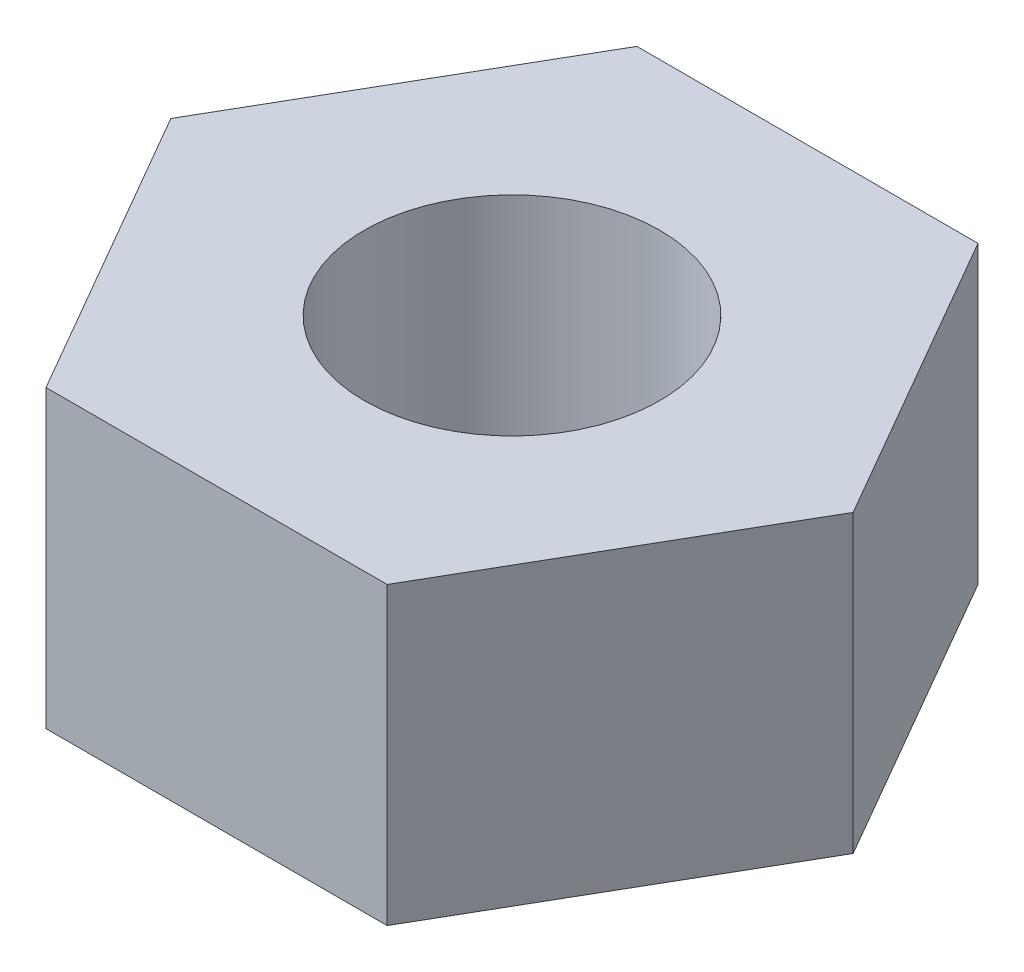
ISO-10303-21;
HEADER;
FILE_DESCRIPTION(('STEP AP214'),'2;1');
FILE_NAME('part.step','',(''),(''),'','','');
FILE_SCHEMA(('AUTOMOTIVE_DESIGN { 1 0 10303 214 1 1 1 1 }'));
ENDSEC;
DATA;
#1=APPLICATION_CONTEXT('core data for automotive mechanical design processes');
#2=APPLICATION_PROTOCOL_DEFINITION('international standard','automotive_design',2000,#1);
#3=PRODUCT_CONTEXT('',#1,'mechanical');
#4=PRODUCT('Part','Part','',(#3));
#5=PRODUCT_RELATED_PRODUCT_CATEGORY('part','',(#4));
#6=PRODUCT_DEFINITION_FORMATION('','',#4);
#7=PRODUCT_DEFINITION_CONTEXT('part definition',#1,'design');
#8=PRODUCT_DEFINITION('design','',#6,#7);
#9=PRODUCT_DEFINITION_SHAPE('','',#8);
#10=(LENGTH_UNIT() NAMED_UNIT(*) SI_UNIT(.MILLI.,.METRE.));
#11=(NAMED_UNIT(*) PLANE_ANGLE_UNIT() SI_UNIT($,.RADIAN.));
#12=(NAMED_UNIT(*) SI_UNIT($,.STERADIAN.) SOLID_ANGLE_UNIT());
#13=UNCERTAINTY_MEASURE_WITH_UNIT(LENGTH_MEASURE(1.E-05),#10,'distance_accuracy_value','');
#14=(GEOMETRIC_REPRESENTATION_CONTEXT(3) GLOBAL_UNCERTAINTY_ASSIGNED_CONTEXT((#13)) GLOBAL_UNIT_ASSIGNED_CONTEXT((#10,
#11,#12)) REPRESENTATION_CONTEXT('',''));
#15=CARTESIAN_POINT('',(0.,0.,0.));
#16=DIRECTION('',(0.,0.,1.));
#17=DIRECTION('',(1.,0.,0.));
#18=AXIS2_PLACEMENT_3D('',#15,#16,#17);
#19=CARTESIAN_POINT('',(0.,3.,0.));
#20=DIRECTION('',(0.,1.,0.));
#21=DIRECTION('',(0.,0.,1.));
#22=AXIS2_PLACEMENT_3D('',#19,#20,#21);
#23=PLANE('',#22);
#24=DIRECTION('',(0.49999999999579,0.,-0.866025403786869));
#25=VECTOR('',#24,1.);
#26=CARTESIAN_POINT('',(1.73205080758832,3.,3.));
#27=LINE('',#26,#25);
#28=CARTESIAN_POINT('',(1.73205080758832,3.,3.));
#29=VERTEX_POINT('',#28);
#30=CARTESIAN_POINT('',(3.46410161514748,3.,-1.68417408882635E-11));
#31=VERTEX_POINT('',#30);
#32=EDGE_CURVE('E139',#29,#31,#27,.T.);
#33=ORIENTED_EDGE('',*,*,#32,.T.);
#34=DIRECTION('',(-0.50000000000421,0.,-0.866025403782008));
#35=VECTOR('',#34,1.);
#36=CARTESIAN_POINT('',(3.46410161514748,3.,-1.68417408882635E-11));
#37=LINE('',#36,#35);
#38=CARTESIAN_POINT('',(1.73205080755915,3.,-3.00000000001684));
#39=VERTEX_POINT('',#38);
#40=EDGE_CURVE('E97',#31,#39,#37,.T.);
#41=ORIENTED_EDGE('',*,*,#40,.T.);
#42=DIRECTION('',(-1.,0.,4.8614900414998E-12));
#43=VECTOR('',#42,1.);
#44=CARTESIAN_POINT('',(1.73205080755915,3.,-3.00000000001684));
#45=LINE('',#44,#43);
#46=CARTESIAN_POINT('',(-1.73205080758832,3.,-3.));
#47=VERTEX_POINT('',#46);
#48=EDGE_CURVE('E110',#39,#47,#45,.T.);
#49=ORIENTED_EDGE('',*,*,#48,.T.);
#50=DIRECTION('',(-0.49999999999579,0.,0.86602540378687));
#51=VECTOR('',#50,1.);
#52=CARTESIAN_POINT('',(-1.73205080758832,3.,-3.));
#53=LINE('',#52,#51);
#54=CARTESIAN_POINT('',(-3.46410161514748,3.,1.68406955047828E-11));
#55=VERTEX_POINT('',#54);
#56=EDGE_CURVE('E104',#47,#55,#53,.T.);
#57=ORIENTED_EDGE('',*,*,#56,.T.);
#58=DIRECTION('',(0.50000000000421,0.,0.866025403782008));
#59=VECTOR('',#58,1.);
#60=CARTESIAN_POINT('',(-3.46410161514748,3.,1.68406955047828E-11));
#61=LINE('',#60,#59);
#62=CARTESIAN_POINT('',(-1.73205080755915,3.,3.00000000001684));
#63=VERTEX_POINT('',#62);
#64=EDGE_CURVE('E108',#55,#63,#61,.T.);
#65=ORIENTED_EDGE('',*,*,#64,.T.);
#66=DIRECTION('',(1.,0.,-4.86136484861658E-12));
#67=VECTOR('',#66,1.);
#68=CARTESIAN_POINT('',(-1.73205080755915,3.,3.00000000001684));
#69=LINE('',#68,#67);
#70=EDGE_CURVE('E60',#63,#29,#69,.T.);
#71=ORIENTED_EDGE('',*,*,#70,.T.);
#72=EDGE_LOOP('',(#33,#41,#49,#57,#65,#71));
#73=FACE_BOUND('',#72,.T.);
#74=CARTESIAN_POINT('',(0.,3.,0.));
#75=DIRECTION('',(0.,1.,0.));
#76=DIRECTION('',(0.,0.,1.));
#77=AXIS2_PLACEMENT_3D('',#74,#75,#76);
#78=CIRCLE('',#77,1.5);
#79=CARTESIAN_POINT('',(0.,3.,1.5));
#80=VERTEX_POINT('',#79);
#81=EDGE_CURVE('E132',#80,#80,#78,.T.);
#82=ORIENTED_EDGE('',*,*,#81,.F.);
#83=EDGE_LOOP('',(#82));
#84=FACE_BOUND('',#83,.T.);
#85=ADVANCED_FACE('F43',(#73,#84),#23,.T.);
#86=CARTESIAN_POINT('',(0.,0.,0.));
#87=DIRECTION('',(0.,1.,0.));
#88=DIRECTION('',(0.,0.,1.));
#89=AXIS2_PLACEMENT_3D('',#86,#87,#88);
#90=PLANE('',#89);
#91=DIRECTION('',(0.49999999999579,0.,-0.866025403786869));
#92=VECTOR('',#91,1.);
#93=CARTESIAN_POINT('',(1.73205080758832,0.,3.));
#94=LINE('',#93,#92);
#95=CARTESIAN_POINT('',(1.73205080758832,0.,3.));
#96=VERTEX_POINT('',#95);
#97=CARTESIAN_POINT('',(3.46410161514748,0.,-1.68417408882635E-11));
#98=VERTEX_POINT('',#97);
#99=EDGE_CURVE('E128',#96,#98,#94,.T.);
#100=ORIENTED_EDGE('',*,*,#99,.F.);
#101=DIRECTION('',(1.,0.,-4.86136484861658E-12));
#102=VECTOR('',#101,1.);
#103=CARTESIAN_POINT('',(-1.73205080755915,0.,3.00000000001684));
#104=LINE('',#103,#102);
#105=CARTESIAN_POINT('',(-1.73205080755915,0.,3.00000000001684));
#106=VERTEX_POINT('',#105);
#107=EDGE_CURVE('E89',#106,#96,#104,.T.);
#108=ORIENTED_EDGE('',*,*,#107,.F.);
#109=DIRECTION('',(0.50000000000421,0.,0.866025403782008));
#110=VECTOR('',#109,1.);
#111=CARTESIAN_POINT('',(-3.46410161514748,0.,1.68406955047828E-11));
#112=LINE('',#111,#110);
#113=CARTESIAN_POINT('',(-3.46410161514748,0.,1.68406955047828E-11));
#114=VERTEX_POINT('',#113);
#115=EDGE_CURVE('E83',#114,#106,#112,.T.);
#116=ORIENTED_EDGE('',*,*,#115,.F.);
#117=DIRECTION('',(-0.49999999999579,0.,0.86602540378687));
#118=VECTOR('',#117,1.);
#119=CARTESIAN_POINT('',(-1.73205080758832,0.,-3.));
#120=LINE('',#119,#118);
#121=CARTESIAN_POINT('',(-1.73205080758832,0.,-3.));
#122=VERTEX_POINT('',#121);
#123=EDGE_CURVE('E118',#122,#114,#120,.T.);
#124=ORIENTED_EDGE('',*,*,#123,.F.);
#125=DIRECTION('',(-1.,0.,4.8614900414998E-12));
#126=VECTOR('',#125,1.);
#127=CARTESIAN_POINT('',(1.73205080755915,0.,-3.00000000001684));
#128=LINE('',#127,#126);
#129=CARTESIAN_POINT('',(1.73205080755915,0.,-3.00000000001684));
#130=VERTEX_POINT('',#129);
#131=EDGE_CURVE('E134',#130,#122,#128,.T.);
#132=ORIENTED_EDGE('',*,*,#131,.F.);
#133=DIRECTION('',(-0.50000000000421,0.,-0.866025403782008));
#134=VECTOR('',#133,1.);
#135=CARTESIAN_POINT('',(3.46410161514748,0.,-1.68417408882635E-11));
#136=LINE('',#135,#134);
#137=EDGE_CURVE('E131',#98,#130,#136,.T.);
#138=ORIENTED_EDGE('',*,*,#137,.F.);
#139=EDGE_LOOP('',(#100,#108,#116,#124,#132,#138));
#140=FACE_BOUND('',#139,.T.);
#141=CARTESIAN_POINT('',(0.,0.,0.));
#142=DIRECTION('',(0.,1.,0.));
#143=DIRECTION('',(0.,0.,1.));
#144=AXIS2_PLACEMENT_3D('',#141,#142,#143);
#145=CIRCLE('',#144,1.5);
#146=CARTESIAN_POINT('',(0.,0.,1.5));
#147=VERTEX_POINT('',#146);
#148=EDGE_CURVE('E232',#147,#147,#145,.T.);
#149=ORIENTED_EDGE('',*,*,#148,.T.);
#150=EDGE_LOOP('',(#149));
#151=FACE_BOUND('',#150,.T.);
#152=ADVANCED_FACE('F148',(#140,#151),#90,.F.);
#153=CARTESIAN_POINT('',(1.73205080758832,3.,3.));
#154=DIRECTION('',(-0.86602540378687,0.,-0.49999999999579));
#155=DIRECTION('',(-0.49999999999579,0.,0.86602540378687));
#156=AXIS2_PLACEMENT_3D('',#153,#154,#155);
#157=PLANE('',#156);
#158=ORIENTED_EDGE('',*,*,#99,.T.);
#159=DIRECTION('',(0.,-1.,0.));
#160=VECTOR('',#159,1.);
#161=CARTESIAN_POINT('',(3.46410161514748,3.,-1.68417408882635E-11));
#162=LINE('',#161,#160);
#163=EDGE_CURVE('E11',#31,#98,#162,.T.);
#164=ORIENTED_EDGE('',*,*,#163,.F.);
#165=ORIENTED_EDGE('',*,*,#32,.F.);
#166=DIRECTION('',(0.,-1.,0.));
#167=VECTOR('',#166,1.);
#168=CARTESIAN_POINT('',(1.73205080758832,3.,3.));
#169=LINE('',#168,#167);
#170=EDGE_CURVE('E124',#29,#96,#169,.T.);
#171=ORIENTED_EDGE('',*,*,#170,.T.);
#172=EDGE_LOOP('',(#158,#164,#165,#171));
#173=FACE_BOUND('',#172,.T.);
#174=ADVANCED_FACE('F45',(#173),#157,.F.);
#175=CARTESIAN_POINT('',(3.46410161514748,3.,-1.68417408882635E-11));
#176=DIRECTION('',(-0.866025403782008,0.,0.50000000000421));
#177=DIRECTION('',(0.50000000000421,0.,0.866025403782008));
#178=AXIS2_PLACEMENT_3D('',#175,#176,#177);
#179=PLANE('',#178);
#180=ORIENTED_EDGE('',*,*,#137,.T.);
#181=DIRECTION('',(0.,-1.,0.));
#182=VECTOR('',#181,1.);
#183=CARTESIAN_POINT('',(1.73205080755915,3.,-3.00000000001684));
#184=LINE('',#183,#182);
#185=EDGE_CURVE('E52',#39,#130,#184,.T.);
#186=ORIENTED_EDGE('',*,*,#185,.F.);
#187=ORIENTED_EDGE('',*,*,#40,.F.);
#188=ORIENTED_EDGE('',*,*,#163,.T.);
#189=EDGE_LOOP('',(#180,#186,#187,#188));
#190=FACE_BOUND('',#189,.T.);
#191=ADVANCED_FACE('F173',(#190),#179,.F.);
#192=CARTESIAN_POINT('',(1.73205080755915,3.,-3.00000000001684));
#193=DIRECTION('',(4.8614900414998E-12,0.,1.));
#194=DIRECTION('',(1.,0.,-4.8614900414998E-12));
#195=AXIS2_PLACEMENT_3D('',#192,#193,#194);
#196=PLANE('',#195);
#197=ORIENTED_EDGE('',*,*,#131,.T.);
#198=DIRECTION('',(0.,-1.,0.));
#199=VECTOR('',#198,1.);
#200=CARTESIAN_POINT('',(-1.73205080758832,3.,-3.));
#201=LINE('',#200,#199);
#202=EDGE_CURVE('E119',#47,#122,#201,.T.);
#203=ORIENTED_EDGE('',*,*,#202,.F.);
#204=ORIENTED_EDGE('',*,*,#48,.F.);
#205=ORIENTED_EDGE('',*,*,#185,.T.);
#206=EDGE_LOOP('',(#197,#203,#204,#205));
#207=FACE_BOUND('',#206,.T.);
#208=ADVANCED_FACE('F145',(#207),#196,.F.);
#209=CARTESIAN_POINT('',(-1.73205080758832,3.,-3.));
#210=DIRECTION('',(0.866025403786869,0.,0.499999999995789));
#211=DIRECTION('',(0.49999999999579,0.,-0.86602540378687));
#212=AXIS2_PLACEMENT_3D('',#209,#210,#211);
#213=PLANE('',#212);
#214=ORIENTED_EDGE('',*,*,#123,.T.);
#215=DIRECTION('',(0.,-1.,0.));
#216=VECTOR('',#215,1.);
#217=CARTESIAN_POINT('',(-3.46410161514748,3.,1.68406955047828E-11));
#218=LINE('',#217,#216);
#219=EDGE_CURVE('E115',#55,#114,#218,.T.);
#220=ORIENTED_EDGE('',*,*,#219,.F.);
#221=ORIENTED_EDGE('',*,*,#56,.F.);
#222=ORIENTED_EDGE('',*,*,#202,.T.);
#223=EDGE_LOOP('',(#214,#220,#221,#222));
#224=FACE_BOUND('',#223,.T.);
#225=ADVANCED_FACE('F116',(#224),#213,.F.);
#226=CARTESIAN_POINT('',(-3.46410161514748,3.,1.68406955047828E-11));
#227=DIRECTION('',(0.866025403782008,0.,-0.50000000000421));
#228=DIRECTION('',(-0.50000000000421,0.,-0.866025403782008));
#229=AXIS2_PLACEMENT_3D('',#226,#227,#228);
#230=PLANE('',#229);
#231=ORIENTED_EDGE('',*,*,#115,.T.);
#232=DIRECTION('',(0.,-1.,0.));
#233=VECTOR('',#232,1.);
#234=CARTESIAN_POINT('',(-1.73205080755915,3.,3.00000000001684));
#235=LINE('',#234,#233);
#236=EDGE_CURVE('E120',#63,#106,#235,.T.);
#237=ORIENTED_EDGE('',*,*,#236,.F.);
#238=ORIENTED_EDGE('',*,*,#64,.F.);
#239=ORIENTED_EDGE('',*,*,#219,.T.);
#240=EDGE_LOOP('',(#231,#237,#238,#239));
#241=FACE_BOUND('',#240,.T.);
#242=ADVANCED_FACE('F122',(#241),#230,.F.);
#243=CARTESIAN_POINT('',(-1.73205080755915,3.,3.00000000001684));
#244=DIRECTION('',(-4.86136484861658E-12,0.,-1.));
#245=DIRECTION('',(-1.,0.,4.86136484861658E-12));
#246=AXIS2_PLACEMENT_3D('',#243,#244,#245);
#247=PLANE('',#246);
#248=ORIENTED_EDGE('',*,*,#107,.T.);
#249=ORIENTED_EDGE('',*,*,#170,.F.);
#250=ORIENTED_EDGE('',*,*,#70,.F.);
#251=ORIENTED_EDGE('',*,*,#236,.T.);
#252=EDGE_LOOP('',(#248,#249,#250,#251));
#253=FACE_BOUND('',#252,.T.);
#254=ADVANCED_FACE('F153',(#253),#247,.F.);
#255=CARTESIAN_POINT('',(0.,3.,0.));
#256=DIRECTION('',(0.,-1.,0.));
#257=DIRECTION('',(0.,0.,-1.));
#258=AXIS2_PLACEMENT_3D('',#255,#256,#257);
#259=CYLINDRICAL_SURFACE('',#258,1.5);
#260=ORIENTED_EDGE('',*,*,#81,.T.);
#261=EDGE_LOOP('',(#260));
#262=FACE_BOUND('',#261,.T.);
#263=ORIENTED_EDGE('',*,*,#148,.F.);
#264=EDGE_LOOP('',(#263));
#265=FACE_BOUND('',#264,.T.);
#266=ADVANCED_FACE('F155',(#262,#265),#259,.F.);
#267=CLOSED_SHELL('',(#85,#152,#174,#191,#208,#225,#242,#254,#266));
#268=MANIFOLD_SOLID_BREP('B2',#267);
#269=ADVANCED_BREP_SHAPE_REPRESENTATION('',(#18,#268),#14);
#270=SHAPE_DEFINITION_REPRESENTATION(#9,#269);
ENDSEC;
END-ISO-10303-21;
